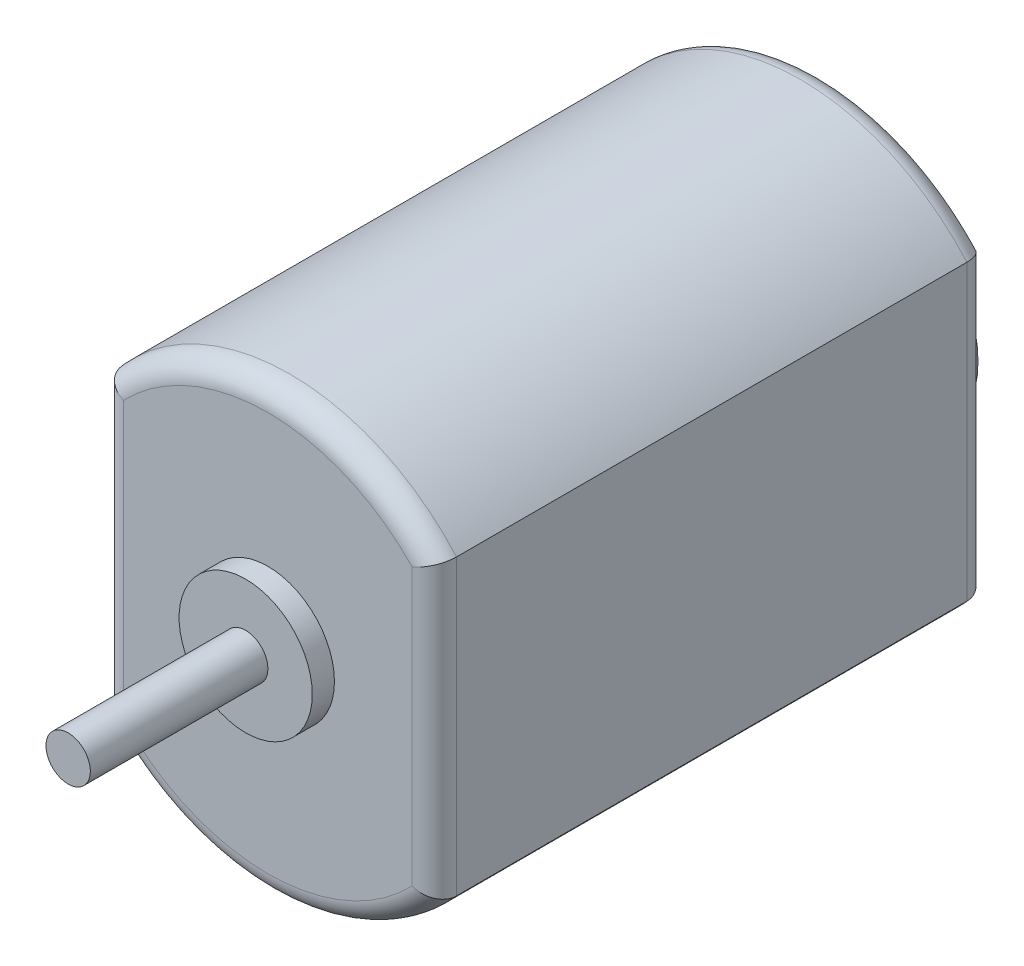
ISO-10303-21;
HEADER;
FILE_DESCRIPTION(('STEP AP214'),'2;1');
FILE_NAME('part.step','',(''),(''),'','','');
FILE_SCHEMA(('AUTOMOTIVE_DESIGN { 1 0 10303 214 1 1 1 1 }'));
ENDSEC;
DATA;
#1=APPLICATION_CONTEXT('core data for automotive mechanical design processes');
#2=APPLICATION_PROTOCOL_DEFINITION('international standard','automotive_design',2000,#1);
#3=PRODUCT_CONTEXT('',#1,'mechanical');
#4=PRODUCT('Part','Part','',(#3));
#5=PRODUCT_RELATED_PRODUCT_CATEGORY('part','',(#4));
#6=PRODUCT_DEFINITION_FORMATION('','',#4);
#7=PRODUCT_DEFINITION_CONTEXT('part definition',#1,'design');
#8=PRODUCT_DEFINITION('design','',#6,#7);
#9=PRODUCT_DEFINITION_SHAPE('','',#8);
#10=(LENGTH_UNIT() NAMED_UNIT(*) SI_UNIT(.MILLI.,.METRE.));
#11=(NAMED_UNIT(*) PLANE_ANGLE_UNIT() SI_UNIT($,.RADIAN.));
#12=(NAMED_UNIT(*) SI_UNIT($,.STERADIAN.) SOLID_ANGLE_UNIT());
#13=UNCERTAINTY_MEASURE_WITH_UNIT(LENGTH_MEASURE(1.E-05),#10,'distance_accuracy_value','');
#14=(GEOMETRIC_REPRESENTATION_CONTEXT(3) GLOBAL_UNCERTAINTY_ASSIGNED_CONTEXT((#13)) GLOBAL_UNIT_ASSIGNED_CONTEXT((#10,
#11,#12)) REPRESENTATION_CONTEXT('',''));
#15=CARTESIAN_POINT('',(0.,0.,0.));
#16=DIRECTION('',(0.,0.,1.));
#17=DIRECTION('',(1.,0.,0.));
#18=AXIS2_PLACEMENT_3D('',#15,#16,#17);
#19=CARTESIAN_POINT('',(0.,0.,-2.));
#20=DIRECTION('',(0.,0.,-1.));
#21=DIRECTION('',(-1.,0.,0.));
#22=AXIS2_PLACEMENT_3D('',#19,#20,#21);
#23=PLANE('',#22);
#24=CARTESIAN_POINT('',(0.,0.,-2.));
#25=DIRECTION('',(0.,0.,-1.));
#26=DIRECTION('',(-1.,0.,0.));
#27=AXIS2_PLACEMENT_3D('',#24,#25,#26);
#28=CIRCLE('',#27,5.);
#29=CARTESIAN_POINT('',(-4.,3.,-2.));
#30=VERTEX_POINT('',#29);
#31=CARTESIAN_POINT('',(-4.,-3.,-2.));
#32=VERTEX_POINT('',#31);
#33=EDGE_CURVE('E130',#30,#32,#28,.T.);
#34=ORIENTED_EDGE('',*,*,#33,.T.);
#35=DIRECTION('',(0.,1.,0.));
#36=VECTOR('',#35,1.);
#37=CARTESIAN_POINT('',(-4.,3.,-2.));
#38=LINE('',#37,#36);
#39=EDGE_CURVE('E119',#32,#30,#38,.T.);
#40=ORIENTED_EDGE('',*,*,#39,.T.);
#41=EDGE_LOOP('',(#34,#40));
#42=FACE_BOUND('',#41,.T.);
#43=CARTESIAN_POINT('',(0.,0.,-2.));
#44=DIRECTION('',(0.,0.,-1.));
#45=DIRECTION('',(-1.,0.,0.));
#46=AXIS2_PLACEMENT_3D('',#43,#44,#45);
#47=CIRCLE('',#46,1.);
#48=CARTESIAN_POINT('',(-1.,0.,-2.));
#49=VERTEX_POINT('',#48);
#50=EDGE_CURVE('E347',#49,#49,#47,.T.);
#51=ORIENTED_EDGE('',*,*,#50,.F.);
#52=EDGE_LOOP('',(#51));
#53=FACE_BOUND('',#52,.T.);
#54=ADVANCED_FACE('F35',(#42,#53),#23,.T.);
#55=CARTESIAN_POINT('',(0.,0.,0.));
#56=DIRECTION('',(0.,0.,1.));
#57=DIRECTION('',(1.,0.,0.));
#58=AXIS2_PLACEMENT_3D('',#55,#56,#57);
#59=PLANE('',#58);
#60=DIRECTION('',(0.,1.,0.));
#61=VECTOR('',#60,1.);
#62=CARTESIAN_POINT('',(6.5,0.,0.));
#63=LINE('',#62,#61);
#64=CARTESIAN_POINT('',(6.5,6.22494979899437,0.));
#65=VERTEX_POINT('',#64);
#66=CARTESIAN_POINT('',(6.5,-6.22494979899437,0.));
#67=VERTEX_POINT('',#66);
#68=EDGE_CURVE('E318',#65,#67,#63,.F.);
#69=ORIENTED_EDGE('',*,*,#68,.T.);
#70=CARTESIAN_POINT('',(0.,0.,0.));
#71=DIRECTION('',(0.,0.,1.));
#72=DIRECTION('',(1.,0.,0.));
#73=AXIS2_PLACEMENT_3D('',#70,#71,#72);
#74=CIRCLE('',#73,9.);
#75=CARTESIAN_POINT('',(-6.5,-6.22494979899437,0.));
#76=VERTEX_POINT('',#75);
#77=EDGE_CURVE('E321',#67,#76,#74,.F.);
#78=ORIENTED_EDGE('',*,*,#77,.T.);
#79=DIRECTION('',(0.,-1.,0.));
#80=VECTOR('',#79,1.);
#81=CARTESIAN_POINT('',(-6.5,0.,0.));
#82=LINE('',#81,#80);
#83=CARTESIAN_POINT('',(-6.5,6.22494979899437,0.));
#84=VERTEX_POINT('',#83);
#85=EDGE_CURVE('E325',#76,#84,#82,.F.);
#86=ORIENTED_EDGE('',*,*,#85,.T.);
#87=CARTESIAN_POINT('',(0.,0.,0.));
#88=DIRECTION('',(0.,0.,1.));
#89=DIRECTION('',(1.,0.,0.));
#90=AXIS2_PLACEMENT_3D('',#87,#88,#89);
#91=CIRCLE('',#90,9.);
#92=EDGE_CURVE('E322',#84,#65,#91,.F.);
#93=ORIENTED_EDGE('',*,*,#92,.T.);
#94=EDGE_LOOP('',(#69,#78,#86,#93));
#95=FACE_BOUND('',#94,.T.);
#96=CARTESIAN_POINT('',(0.,0.,0.));
#97=DIRECTION('',(0.,0.,-1.));
#98=DIRECTION('',(-1.,0.,0.));
#99=AXIS2_PLACEMENT_3D('',#96,#97,#98);
#100=CIRCLE('',#99,5.);
#101=CARTESIAN_POINT('',(-4.,3.,0.));
#102=VERTEX_POINT('',#101);
#103=CARTESIAN_POINT('',(-4.,-3.,0.));
#104=VERTEX_POINT('',#103);
#105=EDGE_CURVE('E137',#102,#104,#100,.T.);
#106=ORIENTED_EDGE('',*,*,#105,.F.);
#107=DIRECTION('',(0.,1.,0.));
#108=VECTOR('',#107,1.);
#109=CARTESIAN_POINT('',(-4.,3.,0.));
#110=LINE('',#109,#108);
#111=EDGE_CURVE('E134',#104,#102,#110,.T.);
#112=ORIENTED_EDGE('',*,*,#111,.F.);
#113=EDGE_LOOP('',(#106,#112));
#114=FACE_BOUND('',#113,.T.);
#115=ADVANCED_FACE('F258',(#95,#114),#59,.F.);
#116=CARTESIAN_POINT('',(0.,0.,26.));
#117=DIRECTION('',(0.,0.,1.));
#118=DIRECTION('',(1.,0.,0.));
#119=AXIS2_PLACEMENT_3D('',#116,#117,#118);
#120=PLANE('',#119);
#121=CARTESIAN_POINT('',(0.,0.,26.));
#122=DIRECTION('',(0.,0.,1.));
#123=DIRECTION('',(1.,0.,0.));
#124=AXIS2_PLACEMENT_3D('',#121,#122,#123);
#125=CIRCLE('',#124,3.);
#126=CARTESIAN_POINT('',(3.,0.,26.));
#127=VERTEX_POINT('',#126);
#128=EDGE_CURVE('E149',#127,#127,#125,.T.);
#129=ORIENTED_EDGE('',*,*,#128,.T.);
#130=EDGE_LOOP('',(#129));
#131=FACE_BOUND('',#130,.T.);
#132=CARTESIAN_POINT('',(0.,0.,26.));
#133=DIRECTION('',(0.,0.,1.));
#134=DIRECTION('',(1.,0.,0.));
#135=AXIS2_PLACEMENT_3D('',#132,#133,#134);
#136=CIRCLE('',#135,1.);
#137=CARTESIAN_POINT('',(1.,0.,26.));
#138=VERTEX_POINT('',#137);
#139=EDGE_CURVE('E138',#138,#138,#136,.T.);
#140=ORIENTED_EDGE('',*,*,#139,.F.);
#141=EDGE_LOOP('',(#140));
#142=FACE_BOUND('',#141,.T.);
#143=ADVANCED_FACE('F265',(#131,#142),#120,.T.);
#144=CARTESIAN_POINT('',(0.,0.,25.));
#145=DIRECTION('',(0.,0.,1.));
#146=DIRECTION('',(1.,0.,0.));
#147=AXIS2_PLACEMENT_3D('',#144,#145,#146);
#148=PLANE('',#147);
#149=DIRECTION('',(0.,-1.,0.));
#150=VECTOR('',#149,1.);
#151=CARTESIAN_POINT('',(-6.5,-6.61437827766148,25.));
#152=LINE('',#151,#150);
#153=CARTESIAN_POINT('',(-6.5,6.22494979899437,25.));
#154=VERTEX_POINT('',#153);
#155=CARTESIAN_POINT('',(-6.5,-6.22494979899437,25.));
#156=VERTEX_POINT('',#155);
#157=EDGE_CURVE('E163',#154,#156,#152,.T.);
#158=ORIENTED_EDGE('',*,*,#157,.T.);
#159=CARTESIAN_POINT('',(0.,0.,25.));
#160=DIRECTION('',(0.,0.,1.));
#161=DIRECTION('',(1.,0.,0.));
#162=AXIS2_PLACEMENT_3D('',#159,#160,#161);
#163=CIRCLE('',#162,9.);
#164=CARTESIAN_POINT('',(6.5,-6.22494979899437,25.));
#165=VERTEX_POINT('',#164);
#166=EDGE_CURVE('E169',#156,#165,#163,.T.);
#167=ORIENTED_EDGE('',*,*,#166,.T.);
#168=DIRECTION('',(0.,1.,0.));
#169=VECTOR('',#168,1.);
#170=CARTESIAN_POINT('',(6.5,6.61437827766148,25.));
#171=LINE('',#170,#169);
#172=CARTESIAN_POINT('',(6.5,6.22494979899437,25.));
#173=VERTEX_POINT('',#172);
#174=EDGE_CURVE('E167',#165,#173,#171,.T.);
#175=ORIENTED_EDGE('',*,*,#174,.T.);
#176=CARTESIAN_POINT('',(0.,0.,25.));
#177=DIRECTION('',(0.,0.,1.));
#178=DIRECTION('',(1.,0.,0.));
#179=AXIS2_PLACEMENT_3D('',#176,#177,#178);
#180=CIRCLE('',#179,9.);
#181=EDGE_CURVE('E165',#173,#154,#180,.T.);
#182=ORIENTED_EDGE('',*,*,#181,.T.);
#183=EDGE_LOOP('',(#158,#167,#175,#182));
#184=FACE_BOUND('',#183,.T.);
#185=CARTESIAN_POINT('',(0.,0.,25.));
#186=DIRECTION('',(0.,0.,1.));
#187=DIRECTION('',(1.,0.,0.));
#188=AXIS2_PLACEMENT_3D('',#185,#186,#187);
#189=CIRCLE('',#188,3.);
#190=CARTESIAN_POINT('',(3.,0.,25.));
#191=VERTEX_POINT('',#190);
#192=EDGE_CURVE('E147',#191,#191,#189,.T.);
#193=ORIENTED_EDGE('',*,*,#192,.F.);
#194=EDGE_LOOP('',(#193));
#195=FACE_BOUND('',#194,.T.);
#196=ADVANCED_FACE('F286',(#184,#195),#148,.T.);
#197=CARTESIAN_POINT('',(0.,0.,25.));
#198=DIRECTION('',(0.,0.,-1.));
#199=DIRECTION('',(-1.,0.,0.));
#200=AXIS2_PLACEMENT_3D('',#197,#198,#199);
#201=CYLINDRICAL_SURFACE('',#200,10.);
#202=DIRECTION('',(0.,0.,-1.));
#203=VECTOR('',#202,1.);
#204=CARTESIAN_POINT('',(7.5,6.61437827766148,25.));
#205=LINE('',#204,#203);
#206=CARTESIAN_POINT('',(7.5,6.61437827766148,24.));
#207=VERTEX_POINT('',#206);
#208=CARTESIAN_POINT('',(7.5,6.61437827766148,1.));
#209=VERTEX_POINT('',#208);
#210=EDGE_CURVE('E152',#207,#209,#205,.T.);
#211=ORIENTED_EDGE('',*,*,#210,.T.);
#212=CARTESIAN_POINT('',(0.,0.,1.));
#213=DIRECTION('',(0.,0.,1.));
#214=DIRECTION('',(1.,0.,0.));
#215=AXIS2_PLACEMENT_3D('',#212,#213,#214);
#216=CIRCLE('',#215,10.);
#217=CARTESIAN_POINT('',(-7.5,6.61437827766148,1.));
#218=VERTEX_POINT('',#217);
#219=EDGE_CURVE('E48',#209,#218,#216,.T.);
#220=ORIENTED_EDGE('',*,*,#219,.T.);
#221=DIRECTION('',(0.,0.,-1.));
#222=VECTOR('',#221,1.);
#223=CARTESIAN_POINT('',(-7.5,6.61437827766148,25.));
#224=LINE('',#223,#222);
#225=CARTESIAN_POINT('',(-7.5,6.61437827766148,24.));
#226=VERTEX_POINT('',#225);
#227=EDGE_CURVE('E161',#226,#218,#224,.T.);
#228=ORIENTED_EDGE('',*,*,#227,.F.);
#229=CARTESIAN_POINT('',(0.,0.,24.));
#230=DIRECTION('',(0.,0.,1.));
#231=DIRECTION('',(1.,0.,0.));
#232=AXIS2_PLACEMENT_3D('',#229,#230,#231);
#233=CIRCLE('',#232,10.);
#234=EDGE_CURVE('E177',#226,#207,#233,.F.);
#235=ORIENTED_EDGE('',*,*,#234,.T.);
#236=EDGE_LOOP('',(#211,#220,#228,#235));
#237=FACE_BOUND('',#236,.T.);
#238=ADVANCED_FACE('F293',(#237),#201,.T.);
#239=CARTESIAN_POINT('',(-7.5,-6.61437827766148,25.));
#240=DIRECTION('',(1.,0.,0.));
#241=DIRECTION('',(0.,0.,-1.));
#242=AXIS2_PLACEMENT_3D('',#239,#240,#241);
#243=PLANE('',#242);
#244=ORIENTED_EDGE('',*,*,#227,.T.);
#245=DIRECTION('',(0.,-1.,0.));
#246=VECTOR('',#245,1.);
#247=CARTESIAN_POINT('',(-7.5,-6.61437827766148,1.));
#248=LINE('',#247,#246);
#249=CARTESIAN_POINT('',(-7.5,-6.61437827766148,1.));
#250=VERTEX_POINT('',#249);
#251=EDGE_CURVE('E11',#218,#250,#248,.T.);
#252=ORIENTED_EDGE('',*,*,#251,.T.);
#253=DIRECTION('',(0.,0.,-1.));
#254=VECTOR('',#253,1.);
#255=CARTESIAN_POINT('',(-7.5,-6.61437827766148,25.));
#256=LINE('',#255,#254);
#257=CARTESIAN_POINT('',(-7.5,-6.61437827766148,24.));
#258=VERTEX_POINT('',#257);
#259=EDGE_CURVE('E158',#258,#250,#256,.T.);
#260=ORIENTED_EDGE('',*,*,#259,.F.);
#261=DIRECTION('',(0.,-1.,0.));
#262=VECTOR('',#261,1.);
#263=CARTESIAN_POINT('',(-7.5,6.61437827766148,24.));
#264=LINE('',#263,#262);
#265=EDGE_CURVE('E179',#258,#226,#264,.F.);
#266=ORIENTED_EDGE('',*,*,#265,.T.);
#267=EDGE_LOOP('',(#244,#252,#260,#266));
#268=FACE_BOUND('',#267,.T.);
#269=ADVANCED_FACE('F301',(#268),#243,.F.);
#270=CARTESIAN_POINT('',(0.,0.,25.));
#271=DIRECTION('',(0.,0.,-1.));
#272=DIRECTION('',(-1.,0.,0.));
#273=AXIS2_PLACEMENT_3D('',#270,#271,#272);
#274=CYLINDRICAL_SURFACE('',#273,10.);
#275=ORIENTED_EDGE('',*,*,#259,.T.);
#276=CARTESIAN_POINT('',(0.,0.,1.));
#277=DIRECTION('',(0.,0.,1.));
#278=DIRECTION('',(1.,0.,0.));
#279=AXIS2_PLACEMENT_3D('',#276,#277,#278);
#280=CIRCLE('',#279,10.);
#281=CARTESIAN_POINT('',(7.5,-6.61437827766148,1.));
#282=VERTEX_POINT('',#281);
#283=EDGE_CURVE('E181',#250,#282,#280,.T.);
#284=ORIENTED_EDGE('',*,*,#283,.T.);
#285=DIRECTION('',(0.,0.,-1.));
#286=VECTOR('',#285,1.);
#287=CARTESIAN_POINT('',(7.5,-6.61437827766148,25.));
#288=LINE('',#287,#286);
#289=CARTESIAN_POINT('',(7.5,-6.61437827766148,24.));
#290=VERTEX_POINT('',#289);
#291=EDGE_CURVE('E156',#290,#282,#288,.T.);
#292=ORIENTED_EDGE('',*,*,#291,.F.);
#293=CARTESIAN_POINT('',(0.,0.,24.));
#294=DIRECTION('',(0.,0.,1.));
#295=DIRECTION('',(1.,0.,0.));
#296=AXIS2_PLACEMENT_3D('',#293,#294,#295);
#297=CIRCLE('',#296,10.);
#298=EDGE_CURVE('E172',#290,#258,#297,.F.);
#299=ORIENTED_EDGE('',*,*,#298,.T.);
#300=EDGE_LOOP('',(#275,#284,#292,#299));
#301=FACE_BOUND('',#300,.T.);
#302=ADVANCED_FACE('F298',(#301),#274,.T.);
#303=CARTESIAN_POINT('',(7.5,-6.61437827766148,25.));
#304=DIRECTION('',(-1.,0.,0.));
#305=DIRECTION('',(0.,-1.,0.));
#306=AXIS2_PLACEMENT_3D('',#303,#304,#305);
#307=PLANE('',#306);
#308=ORIENTED_EDGE('',*,*,#291,.T.);
#309=DIRECTION('',(0.,1.,0.));
#310=VECTOR('',#309,1.);
#311=CARTESIAN_POINT('',(7.5,-6.61437827766148,1.));
#312=LINE('',#311,#310);
#313=EDGE_CURVE('E63',#282,#209,#312,.T.);
#314=ORIENTED_EDGE('',*,*,#313,.T.);
#315=ORIENTED_EDGE('',*,*,#210,.F.);
#316=DIRECTION('',(0.,1.,0.));
#317=VECTOR('',#316,1.);
#318=CARTESIAN_POINT('',(7.5,-6.61437827766148,24.));
#319=LINE('',#318,#317);
#320=EDGE_CURVE('E175',#207,#290,#319,.F.);
#321=ORIENTED_EDGE('',*,*,#320,.T.);
#322=EDGE_LOOP('',(#308,#314,#315,#321));
#323=FACE_BOUND('',#322,.T.);
#324=ADVANCED_FACE('F290',(#323),#307,.F.);
#325=CARTESIAN_POINT('',(0.,0.,26.));
#326=DIRECTION('',(0.,0.,-1.));
#327=DIRECTION('',(-1.,0.,0.));
#328=AXIS2_PLACEMENT_3D('',#325,#326,#327);
#329=CYLINDRICAL_SURFACE('',#328,3.);
#330=ORIENTED_EDGE('',*,*,#128,.F.);
#331=EDGE_LOOP('',(#330));
#332=FACE_BOUND('',#331,.T.);
#333=ORIENTED_EDGE('',*,*,#192,.T.);
#334=EDGE_LOOP('',(#333));
#335=FACE_BOUND('',#334,.T.);
#336=ADVANCED_FACE('F282',(#332,#335),#329,.T.);
#337=CARTESIAN_POINT('',(0.,0.,34.));
#338=DIRECTION('',(0.,0.,-1.));
#339=DIRECTION('',(-1.,0.,0.));
#340=AXIS2_PLACEMENT_3D('',#337,#338,#339);
#341=CYLINDRICAL_SURFACE('',#340,1.);
#342=CARTESIAN_POINT('',(0.,0.,34.));
#343=DIRECTION('',(0.,0.,1.));
#344=DIRECTION('',(1.,0.,0.));
#345=AXIS2_PLACEMENT_3D('',#342,#343,#344);
#346=CIRCLE('',#345,1.);
#347=CARTESIAN_POINT('',(1.,0.,34.));
#348=VERTEX_POINT('',#347);
#349=EDGE_CURVE('E141',#348,#348,#346,.T.);
#350=ORIENTED_EDGE('',*,*,#349,.F.);
#351=EDGE_LOOP('',(#350));
#352=FACE_BOUND('',#351,.T.);
#353=ORIENTED_EDGE('',*,*,#139,.T.);
#354=EDGE_LOOP('',(#353));
#355=FACE_BOUND('',#354,.T.);
#356=ADVANCED_FACE('F278',(#352,#355),#341,.T.);
#357=CARTESIAN_POINT('',(0.,0.,34.));
#358=DIRECTION('',(0.,0.,1.));
#359=DIRECTION('',(1.,0.,0.));
#360=AXIS2_PLACEMENT_3D('',#357,#358,#359);
#361=PLANE('',#360);
#362=ORIENTED_EDGE('',*,*,#349,.T.);
#363=EDGE_LOOP('',(#362));
#364=FACE_BOUND('',#363,.T.);
#365=ADVANCED_FACE('F275',(#364),#361,.T.);
#366=CARTESIAN_POINT('',(0.,0.,-2.));
#367=DIRECTION('',(0.,0.,1.));
#368=DIRECTION('',(1.,0.,0.));
#369=AXIS2_PLACEMENT_3D('',#366,#367,#368);
#370=CYLINDRICAL_SURFACE('',#369,5.);
#371=ORIENTED_EDGE('',*,*,#105,.T.);
#372=DIRECTION('',(0.,0.,1.));
#373=VECTOR('',#372,1.);
#374=CARTESIAN_POINT('',(-4.,-3.,-2.));
#375=LINE('',#374,#373);
#376=EDGE_CURVE('E124',#32,#104,#375,.T.);
#377=ORIENTED_EDGE('',*,*,#376,.F.);
#378=ORIENTED_EDGE('',*,*,#33,.F.);
#379=DIRECTION('',(0.,0.,1.));
#380=VECTOR('',#379,1.);
#381=CARTESIAN_POINT('',(-4.,3.,-2.));
#382=LINE('',#381,#380);
#383=EDGE_CURVE('E127',#30,#102,#382,.T.);
#384=ORIENTED_EDGE('',*,*,#383,.T.);
#385=EDGE_LOOP('',(#371,#377,#378,#384));
#386=FACE_BOUND('',#385,.T.);
#387=ADVANCED_FACE('F136',(#386),#370,.T.);
#388=CARTESIAN_POINT('',(-4.,3.,-2.));
#389=DIRECTION('',(1.,0.,0.));
#390=DIRECTION('',(0.,1.,0.));
#391=AXIS2_PLACEMENT_3D('',#388,#389,#390);
#392=PLANE('',#391);
#393=ORIENTED_EDGE('',*,*,#111,.T.);
#394=ORIENTED_EDGE('',*,*,#383,.F.);
#395=ORIENTED_EDGE('',*,*,#39,.F.);
#396=ORIENTED_EDGE('',*,*,#376,.T.);
#397=EDGE_LOOP('',(#393,#394,#395,#396));
#398=FACE_BOUND('',#397,.T.);
#399=ADVANCED_FACE('F122',(#398),#392,.F.);
#400=CARTESIAN_POINT('',(0.,0.,-2.5));
#401=DIRECTION('',(0.,0.,1.));
#402=DIRECTION('',(1.,0.,0.));
#403=AXIS2_PLACEMENT_3D('',#400,#401,#402);
#404=CYLINDRICAL_SURFACE('',#403,1.);
#405=CARTESIAN_POINT('',(0.,0.,-2.5));
#406=DIRECTION('',(0.,0.,-1.));
#407=DIRECTION('',(-1.,0.,0.));
#408=AXIS2_PLACEMENT_3D('',#405,#406,#407);
#409=CIRCLE('',#408,1.);
#410=CARTESIAN_POINT('',(-1.,0.,-2.5));
#411=VERTEX_POINT('',#410);
#412=EDGE_CURVE('E344',#411,#411,#409,.T.);
#413=ORIENTED_EDGE('',*,*,#412,.F.);
#414=EDGE_LOOP('',(#413));
#415=FACE_BOUND('',#414,.T.);
#416=ORIENTED_EDGE('',*,*,#50,.T.);
#417=EDGE_LOOP('',(#416));
#418=FACE_BOUND('',#417,.T.);
#419=ADVANCED_FACE('F270',(#415,#418),#404,.T.);
#420=CARTESIAN_POINT('',(0.,0.,-2.5));
#421=DIRECTION('',(0.,0.,-1.));
#422=DIRECTION('',(-1.,0.,0.));
#423=AXIS2_PLACEMENT_3D('',#420,#421,#422);
#424=PLANE('',#423);
#425=ORIENTED_EDGE('',*,*,#412,.T.);
#426=EDGE_LOOP('',(#425));
#427=FACE_BOUND('',#426,.T.);
#428=ADVANCED_FACE('F221',(#427),#424,.T.);
#429=CARTESIAN_POINT('',(0.,0.,24.));
#430=DIRECTION('',(0.,0.,1.));
#431=DIRECTION('',(1.,0.,0.));
#432=AXIS2_PLACEMENT_3D('',#429,#430,#431);
#433=TOROIDAL_SURFACE('',#432,9.,1.);
#434=CARTESIAN_POINT('',(7.5,6.61437827766148,24.));
#435=CARTESIAN_POINT('',(7.50000070775486,6.61437842210406,24.0268030740604));
#436=CARTESIAN_POINT('',(7.49892164208524,6.61397070938767,24.0535928341524));
#437=CARTESIAN_POINT('',(7.49462277672622,6.61234564054268,24.1069707050066));
#438=CARTESIAN_POINT('',(7.49140334794055,6.61112842469292,24.1335588498995));
#439=CARTESIAN_POINT('',(7.47859025944818,6.60628204016919,24.2125990543511));
#440=CARTESIAN_POINT('',(7.46584151209883,6.60145803941142,24.2645050293058));
#441=CARTESIAN_POINT('',(7.43241945200209,6.58878872253937,24.3652610470786));
#442=CARTESIAN_POINT('',(7.41174716753527,6.58094379846615,24.4141114854738));
#443=CARTESIAN_POINT('',(7.36322931625037,6.56248668410333,24.5075492341123));
#444=CARTESIAN_POINT('',(7.33538183562103,6.55187375550575,24.5521354026067));
#445=CARTESIAN_POINT('',(7.27264796246685,6.52789298757729,24.6370836824597));
#446=CARTESIAN_POINT('',(7.23759790181229,6.5144608992878,24.6773064343941));
#447=CARTESIAN_POINT('',(7.16204782264177,6.48540284017042,24.7513264250274));
#448=CARTESIAN_POINT('',(7.12154608000981,6.46977617523094,24.785121622795));
#449=CARTESIAN_POINT('',(7.03363450295053,6.43571904228458,24.8475351466267));
#450=CARTESIAN_POINT('',(6.98595337277782,6.41717541093012,24.875709029581));
#451=CARTESIAN_POINT('',(6.88711287674907,6.37855287997912,24.9236673412623));
#452=CARTESIAN_POINT('',(6.83595263840904,6.35847359511585,24.9434496564989));
#453=CARTESIAN_POINT('',(6.73862844503145,6.32008383207698,24.9722513830427));
#454=CARTESIAN_POINT('',(6.69273143074326,6.30190425530877,24.9823687614689));
#455=CARTESIAN_POINT('',(6.6002199520826,6.26509673268579,24.9960597835253));
#456=CARTESIAN_POINT('',(6.55360707098905,6.24646973591246,24.9996462195082));
#457=CARTESIAN_POINT('',(6.50470455666489,6.22683898090259,24.9999917192456));
#458=CARTESIAN_POINT('',(6.50235216794491,6.22589445404307,25.0000000200304));
#459=CARTESIAN_POINT('',(6.5,6.22494979899437,25.));
#460=B_SPLINE_CURVE_WITH_KNOTS('',3,(#434,#435,#436,#437,#438,#439,#440,#441,#442,#443,#444,
#445,#446,#447,#448,#449,#450,#451,#452,#453,#454,#455,#456,#457,#458,#459),.UNSPECIFIED.,.F.,
.F.,(4,2,2,2,2,2,2,2,2,2,2,2,4),(0.,0.0803582131555684,0.160702504657557,0.320863669673694,
0.481004056736592,0.641187201698183,0.805520254521724,0.969905400968539,1.14436927926721,
1.31887707178089,1.46964837101099,1.62012403101409,1.62772879347805),.UNSPECIFIED.);
#461=EDGE_CURVE('E206',#207,#173,#460,.T.);
#462=ORIENTED_EDGE('',*,*,#461,.F.);
#463=ORIENTED_EDGE('',*,*,#234,.F.);
#464=CARTESIAN_POINT('',(-7.5,6.61437827766148,24.));
#465=CARTESIAN_POINT('',(-7.50000070775486,6.61437842210406,24.0268030740604));
#466=CARTESIAN_POINT('',(-7.49892164208524,6.61397070938767,24.0535928341524));
#467=CARTESIAN_POINT('',(-7.49462277672622,6.61234564054268,24.1069707050066));
#468=CARTESIAN_POINT('',(-7.49140334794055,6.61112842469292,24.1335588498995));
#469=CARTESIAN_POINT('',(-7.47859025944818,6.60628204016919,24.2125990543511));
#470=CARTESIAN_POINT('',(-7.46584151209883,6.60145803941142,24.2645050293058));
#471=CARTESIAN_POINT('',(-7.43241945200209,6.58878872253937,24.3652610470786));
#472=CARTESIAN_POINT('',(-7.41174716753527,6.58094379846615,24.4141114854738));
#473=CARTESIAN_POINT('',(-7.36322931625037,6.56248668410333,24.5075492341123));
#474=CARTESIAN_POINT('',(-7.33538183562103,6.55187375550575,24.5521354026067));
#475=CARTESIAN_POINT('',(-7.27264796246685,6.52789298757729,24.6370836824597));
#476=CARTESIAN_POINT('',(-7.23759790181229,6.5144608992878,24.6773064343941));
#477=CARTESIAN_POINT('',(-7.16204782264177,6.48540284017042,24.7513264250274));
#478=CARTESIAN_POINT('',(-7.1215460800098,6.46977617523094,24.785121622795));
#479=CARTESIAN_POINT('',(-7.03363450295053,6.43571904228458,24.8475351466267));
#480=CARTESIAN_POINT('',(-6.98595337277782,6.41717541093012,24.875709029581));
#481=CARTESIAN_POINT('',(-6.88711287674907,6.37855287997912,24.9236673412623));
#482=CARTESIAN_POINT('',(-6.83595263840904,6.35847359511585,24.9434496564989));
#483=CARTESIAN_POINT('',(-6.73862844503145,6.32008383207698,24.9722513830427));
#484=CARTESIAN_POINT('',(-6.69273143074326,6.30190425530877,24.9823687614689));
#485=CARTESIAN_POINT('',(-6.60021995208261,6.26509673268578,24.9960597835253));
#486=CARTESIAN_POINT('',(-6.55360707098905,6.24646973591245,24.9996462195082));
#487=CARTESIAN_POINT('',(-6.50470455666489,6.22683898090259,24.9999917192456));
#488=CARTESIAN_POINT('',(-6.50235216794491,6.22589445404307,25.0000000200304));
#489=CARTESIAN_POINT('',(-6.5,6.22494979899437,25.));
#490=B_SPLINE_CURVE_WITH_KNOTS('',3,(#464,#465,#466,#467,#468,#469,#470,#471,#472,#473,#474,
#475,#476,#477,#478,#479,#480,#481,#482,#483,#484,#485,#486,#487,#488,#489),.UNSPECIFIED.,.F.,
.F.,(4,2,2,2,2,2,2,2,2,2,2,2,4),(0.,0.0803582131555684,0.160702504657557,0.320863669673694,
0.481004056736592,0.641187201698183,0.805520254521728,0.969905400968539,1.14436927926721,
1.31887707178089,1.46964837101099,1.62012403101409,1.62772879347805),.UNSPECIFIED.);
#491=EDGE_CURVE('E212',#154,#226,#490,.F.);
#492=ORIENTED_EDGE('',*,*,#491,.F.);
#493=ORIENTED_EDGE('',*,*,#181,.F.);
#494=EDGE_LOOP('',(#462,#463,#492,#493));
#495=FACE_BOUND('',#494,.T.);
#496=ADVANCED_FACE('F217',(#495),#433,.T.);
#497=CARTESIAN_POINT('',(-6.5,0.,24.));
#498=DIRECTION('',(0.,1.,0.));
#499=DIRECTION('',(0.,0.,1.));
#500=AXIS2_PLACEMENT_3D('',#497,#498,#499);
#501=CYLINDRICAL_SURFACE('',#500,1.);
#502=ORIENTED_EDGE('',*,*,#491,.T.);
#503=ORIENTED_EDGE('',*,*,#265,.F.);
#504=CARTESIAN_POINT('',(-7.5,-6.61437827766148,24.));
#505=CARTESIAN_POINT('',(-7.50000070775486,-6.61437842210406,24.0268030740604));
#506=CARTESIAN_POINT('',(-7.49892164208524,-6.61397070938767,24.0535928341524));
#507=CARTESIAN_POINT('',(-7.49462277672622,-6.61234564054268,24.1069707050066));
#508=CARTESIAN_POINT('',(-7.49140334794055,-6.61112842469292,24.1335588498995));
#509=CARTESIAN_POINT('',(-7.47859025944818,-6.60628204016919,24.2125990543511));
#510=CARTESIAN_POINT('',(-7.46584151209883,-6.60145803941142,24.2645050293058));
#511=CARTESIAN_POINT('',(-7.43241945200209,-6.58878872253937,24.3652610470786));
#512=CARTESIAN_POINT('',(-7.41174716753527,-6.58094379846615,24.4141114854738));
#513=CARTESIAN_POINT('',(-7.36322931625037,-6.56248668410334,24.5075492341123));
#514=CARTESIAN_POINT('',(-7.33538183562103,-6.55187375550575,24.5521354026067));
#515=CARTESIAN_POINT('',(-7.27264796246685,-6.52789298757729,24.6370836824597));
#516=CARTESIAN_POINT('',(-7.23759790181229,-6.5144608992878,24.6773064343941));
#517=CARTESIAN_POINT('',(-7.16204782264177,-6.48540284017042,24.7513264250274));
#518=CARTESIAN_POINT('',(-7.12154608000981,-6.46977617523094,24.785121622795));
#519=CARTESIAN_POINT('',(-7.03363450295053,-6.43571904228458,24.8475351466267));
#520=CARTESIAN_POINT('',(-6.98595337277782,-6.41717541093012,24.875709029581));
#521=CARTESIAN_POINT('',(-6.88711287674907,-6.37855287997912,24.9236673412623));
#522=CARTESIAN_POINT('',(-6.83595263840904,-6.35847359511585,24.9434496564989));
#523=CARTESIAN_POINT('',(-6.73862844503145,-6.32008383207698,24.9722513830427));
#524=CARTESIAN_POINT('',(-6.69273143074326,-6.30190425530877,24.9823687614689));
#525=CARTESIAN_POINT('',(-6.60021995208261,-6.26509673268578,24.9960597835253));
#526=CARTESIAN_POINT('',(-6.55360707098905,-6.24646973591244,24.9996462195082));
#527=CARTESIAN_POINT('',(-6.50470455666489,-6.22683898090258,24.9999917192456));
#528=CARTESIAN_POINT('',(-6.50235216794491,-6.22589445404307,25.0000000200304));
#529=CARTESIAN_POINT('',(-6.5,-6.22494979899437,25.));
#530=B_SPLINE_CURVE_WITH_KNOTS('',3,(#504,#505,#506,#507,#508,#509,#510,#511,#512,#513,#514,
#515,#516,#517,#518,#519,#520,#521,#522,#523,#524,#525,#526,#527,#528,#529),.UNSPECIFIED.,.F.,
.F.,(4,2,2,2,2,2,2,2,2,2,2,2,4),(0.,0.0803582131555683,0.16070250465756,0.320863669673694,
0.481004056736594,0.641187201698183,0.805520254521724,0.969905400968539,1.14436927926721,
1.31887707178089,1.46964837101099,1.62012403101409,1.62772879347805),.UNSPECIFIED.);
#531=EDGE_CURVE('E189',#156,#258,#530,.F.);
#532=ORIENTED_EDGE('',*,*,#531,.F.);
#533=ORIENTED_EDGE('',*,*,#157,.F.);
#534=EDGE_LOOP('',(#502,#503,#532,#533));
#535=FACE_BOUND('',#534,.T.);
#536=ADVANCED_FACE('F201',(#535),#501,.T.);
#537=CARTESIAN_POINT('',(6.5,0.,24.));
#538=DIRECTION('',(0.,-1.,0.));
#539=DIRECTION('',(1.,0.,0.));
#540=AXIS2_PLACEMENT_3D('',#537,#538,#539);
#541=CYLINDRICAL_SURFACE('',#540,1.);
#542=ORIENTED_EDGE('',*,*,#461,.T.);
#543=ORIENTED_EDGE('',*,*,#174,.F.);
#544=CARTESIAN_POINT('',(7.5,-6.61437827766148,24.));
#545=CARTESIAN_POINT('',(7.50000070775486,-6.61437842210406,24.0268030740604));
#546=CARTESIAN_POINT('',(7.49892164208523,-6.61397070938768,24.0535928341524));
#547=CARTESIAN_POINT('',(7.49462277672622,-6.61234564054268,24.1069707050066));
#548=CARTESIAN_POINT('',(7.49140334794055,-6.61112842469292,24.1335588498995));
#549=CARTESIAN_POINT('',(7.47859025944818,-6.60628204016919,24.2125990543511));
#550=CARTESIAN_POINT('',(7.46584151209883,-6.60145803941142,24.2645050293058));
#551=CARTESIAN_POINT('',(7.43241945200208,-6.58878872253937,24.3652610470786));
#552=CARTESIAN_POINT('',(7.41174716753527,-6.58094379846615,24.4141114854738));
#553=CARTESIAN_POINT('',(7.36322931625037,-6.56248668410334,24.5075492341123));
#554=CARTESIAN_POINT('',(7.33538183562103,-6.55187375550575,24.5521354026067));
#555=CARTESIAN_POINT('',(7.27264796246685,-6.52789298757729,24.6370836824597));
#556=CARTESIAN_POINT('',(7.23759790181229,-6.51446089928781,24.6773064343941));
#557=CARTESIAN_POINT('',(7.16204782264176,-6.48540284017043,24.7513264250274));
#558=CARTESIAN_POINT('',(7.1215460800098,-6.46977617523094,24.785121622795));
#559=CARTESIAN_POINT('',(7.03363450295053,-6.43571904228458,24.8475351466267));
#560=CARTESIAN_POINT('',(6.98595337277782,-6.41717541093012,24.875709029581));
#561=CARTESIAN_POINT('',(6.88711287674907,-6.37855287997912,24.9236673412623));
#562=CARTESIAN_POINT('',(6.83595263840904,-6.35847359511585,24.9434496564989));
#563=CARTESIAN_POINT('',(6.73862844503145,-6.32008383207698,24.9722513830427));
#564=CARTESIAN_POINT('',(6.69273143074326,-6.30190425530877,24.9823687614689));
#565=CARTESIAN_POINT('',(6.6002199520826,-6.26509673268579,24.9960597835253));
#566=CARTESIAN_POINT('',(6.55360707098905,-6.24646973591246,24.9996462195082));
#567=CARTESIAN_POINT('',(6.50470455666489,-6.22683898090259,24.9999917192456));
#568=CARTESIAN_POINT('',(6.50235216794491,-6.22589445404307,25.0000000200304));
#569=CARTESIAN_POINT('',(6.5,-6.22494979899437,25.));
#570=B_SPLINE_CURVE_WITH_KNOTS('',3,(#544,#545,#546,#547,#548,#549,#550,#551,#552,#553,#554,
#555,#556,#557,#558,#559,#560,#561,#562,#563,#564,#565,#566,#567,#568,#569),.UNSPECIFIED.,.F.,
.F.,(4,2,2,2,2,2,2,2,2,2,2,2,4),(0.,0.0803582131555684,0.16070250465756,0.320863669673694,
0.481004056736595,0.641187201698183,0.805520254521727,0.969905400968539,1.14436927926721,
1.31887707178089,1.46964837101099,1.62012403101409,1.62772879347805),.UNSPECIFIED.);
#571=EDGE_CURVE('E182',#290,#165,#570,.T.);
#572=ORIENTED_EDGE('',*,*,#571,.F.);
#573=ORIENTED_EDGE('',*,*,#320,.F.);
#574=EDGE_LOOP('',(#542,#543,#572,#573));
#575=FACE_BOUND('',#574,.T.);
#576=ADVANCED_FACE('F198',(#575),#541,.T.);
#577=CARTESIAN_POINT('',(0.,0.,24.));
#578=DIRECTION('',(0.,0.,1.));
#579=DIRECTION('',(1.,0.,0.));
#580=AXIS2_PLACEMENT_3D('',#577,#578,#579);
#581=TOROIDAL_SURFACE('',#580,9.,1.);
#582=ORIENTED_EDGE('',*,*,#531,.T.);
#583=ORIENTED_EDGE('',*,*,#298,.F.);
#584=ORIENTED_EDGE('',*,*,#571,.T.);
#585=ORIENTED_EDGE('',*,*,#166,.F.);
#586=EDGE_LOOP('',(#582,#583,#584,#585));
#587=FACE_BOUND('',#586,.T.);
#588=ADVANCED_FACE('F195',(#587),#581,.T.);
#589=CARTESIAN_POINT('',(0.,0.,1.));
#590=DIRECTION('',(0.,0.,1.));
#591=DIRECTION('',(1.,0.,0.));
#592=AXIS2_PLACEMENT_3D('',#589,#590,#591);
#593=TOROIDAL_SURFACE('',#592,9.,1.);
#594=CARTESIAN_POINT('',(7.5,6.61437827766148,1.));
#595=CARTESIAN_POINT('',(7.50000070775486,6.61437842210406,0.973196925939596));
#596=CARTESIAN_POINT('',(7.49892164208524,6.61397070938767,0.946407165847617));
#597=CARTESIAN_POINT('',(7.49462277672622,6.61234564054268,0.893029294993394));
#598=CARTESIAN_POINT('',(7.49140334794055,6.61112842469292,0.866441150100488));
#599=CARTESIAN_POINT('',(7.47859025944818,6.60628204016919,0.787400945648916));
#600=CARTESIAN_POINT('',(7.46584151209883,6.60145803941142,0.735494970694172));
#601=CARTESIAN_POINT('',(7.43241945200209,6.58878872253937,0.634738952921378));
#602=CARTESIAN_POINT('',(7.41174716753527,6.58094379846615,0.585888514526164));
#603=CARTESIAN_POINT('',(7.36322931625037,6.56248668410333,0.492450765887692));
#604=CARTESIAN_POINT('',(7.33538183562103,6.55187375550575,0.447864597393274));
#605=CARTESIAN_POINT('',(7.27264796246686,6.52789298757729,0.362916317540279));
#606=CARTESIAN_POINT('',(7.23759790181229,6.51446089928781,0.322693565605929));
#607=CARTESIAN_POINT('',(7.16204782264177,6.48540284017042,0.248673574972567));
#608=CARTESIAN_POINT('',(7.1215460800098,6.46977617523094,0.214878377204983));
#609=CARTESIAN_POINT('',(7.03363450295053,6.43571904228458,0.152464853373274));
#610=CARTESIAN_POINT('',(6.98595337277782,6.41717541093012,0.124290970418982));
#611=CARTESIAN_POINT('',(6.88711287674907,6.37855287997911,0.0763326587377154));
#612=CARTESIAN_POINT('',(6.83595263840905,6.35847359511584,0.0565503435010738));
#613=CARTESIAN_POINT('',(6.73862844503144,6.32008383207699,0.0277486169573414));
#614=CARTESIAN_POINT('',(6.69273143074324,6.30190425530881,0.0176312385311318));
#615=CARTESIAN_POINT('',(6.60021995208262,6.26509673268574,0.00394021647468989));
#616=CARTESIAN_POINT('',(6.55360707098912,6.24646973591228,0.000353780491844683));
#617=CARTESIAN_POINT('',(6.5047045566649,6.22683898090257,8.28075438609944E-06));
#618=CARTESIAN_POINT('',(6.50235216794491,6.22589445404306,-2.00303981307657E-08));
#619=CARTESIAN_POINT('',(6.5,6.22494979899437,0.));
#620=B_SPLINE_CURVE_WITH_KNOTS('',3,(#594,#595,#596,#597,#598,#599,#600,#601,#602,#603,#604,
#605,#606,#607,#608,#609,#610,#611,#612,#613,#614,#615,#616,#617,#618,#619),.UNSPECIFIED.,.F.,
.F.,(4,2,2,2,2,2,2,2,2,2,2,2,4),(0.,0.0803582131555716,0.160702504657558,0.320863669673695,
0.481004056736591,0.641187201698179,0.805520254521726,0.969905400968541,1.14436927926721,
1.31887707178089,1.46964837101099,1.62012403101409,1.62772879347805),.UNSPECIFIED.);
#621=EDGE_CURVE('E239',#65,#209,#620,.F.);
#622=ORIENTED_EDGE('',*,*,#621,.F.);
#623=ORIENTED_EDGE('',*,*,#92,.F.);
#624=CARTESIAN_POINT('',(-7.5,6.61437827766148,1.));
#625=CARTESIAN_POINT('',(-7.50000070775486,6.61437842210406,0.973196925939596));
#626=CARTESIAN_POINT('',(-7.49892164208524,6.61397070938767,0.946407165847617));
#627=CARTESIAN_POINT('',(-7.49462277672622,6.61234564054268,0.893029294993394));
#628=CARTESIAN_POINT('',(-7.49140334794055,6.61112842469292,0.866441150100488));
#629=CARTESIAN_POINT('',(-7.47859025944818,6.60628204016919,0.787400945648916));
#630=CARTESIAN_POINT('',(-7.46584151209883,6.60145803941142,0.735494970694172));
#631=CARTESIAN_POINT('',(-7.43241945200209,6.58878872253937,0.634738952921378));
#632=CARTESIAN_POINT('',(-7.41174716753527,6.58094379846615,0.585888514526164));
#633=CARTESIAN_POINT('',(-7.36322931625037,6.56248668410333,0.492450765887692));
#634=CARTESIAN_POINT('',(-7.33538183562103,6.55187375550575,0.447864597393274));
#635=CARTESIAN_POINT('',(-7.27264796246686,6.52789298757729,0.362916317540279));
#636=CARTESIAN_POINT('',(-7.23759790181229,6.51446089928781,0.322693565605929));
#637=CARTESIAN_POINT('',(-7.16204782264177,6.48540284017042,0.248673574972567));
#638=CARTESIAN_POINT('',(-7.1215460800098,6.46977617523094,0.214878377204983));
#639=CARTESIAN_POINT('',(-7.03363450295053,6.43571904228458,0.152464853373274));
#640=CARTESIAN_POINT('',(-6.98595337277782,6.41717541093012,0.124290970418982));
#641=CARTESIAN_POINT('',(-6.88711287674907,6.37855287997911,0.0763326587377155));
#642=CARTESIAN_POINT('',(-6.83595263840905,6.35847359511584,0.0565503435010738));
#643=CARTESIAN_POINT('',(-6.73862844503144,6.32008383207699,0.0277486169573414));
#644=CARTESIAN_POINT('',(-6.69273143074324,6.30190425530881,0.0176312385311317));
#645=CARTESIAN_POINT('',(-6.60021995208262,6.26509673268574,0.00394021647468986));
#646=CARTESIAN_POINT('',(-6.55360707098912,6.24646973591228,0.000353780491844823));
#647=CARTESIAN_POINT('',(-6.5047045566649,6.22683898090257,8.28075438611374E-06));
#648=CARTESIAN_POINT('',(-6.50235216794491,6.22589445404306,-2.00303981232252E-08));
#649=CARTESIAN_POINT('',(-6.5,6.22494979899437,0.));
#650=B_SPLINE_CURVE_WITH_KNOTS('',3,(#624,#625,#626,#627,#628,#629,#630,#631,#632,#633,#634,
#635,#636,#637,#638,#639,#640,#641,#642,#643,#644,#645,#646,#647,#648,#649),.UNSPECIFIED.,.F.,
.F.,(4,2,2,2,2,2,2,2,2,2,2,2,4),(0.,0.0803582131555716,0.160702504657558,0.320863669673695,
0.481004056736591,0.641187201698179,0.805520254521726,0.969905400968541,1.14436927926721,
1.31887707178089,1.46964837101099,1.62012403101409,1.62772879347805),.UNSPECIFIED.);
#651=EDGE_CURVE('E40',#218,#84,#650,.T.);
#652=ORIENTED_EDGE('',*,*,#651,.F.);
#653=ORIENTED_EDGE('',*,*,#219,.F.);
#654=EDGE_LOOP('',(#622,#623,#652,#653));
#655=FACE_BOUND('',#654,.T.);
#656=ADVANCED_FACE('F37',(#655),#593,.T.);
#657=CARTESIAN_POINT('',(-6.5,-6.61437827766148,1.));
#658=DIRECTION('',(0.,-1.,0.));
#659=DIRECTION('',(0.,0.,-1.));
#660=AXIS2_PLACEMENT_3D('',#657,#658,#659);
#661=CYLINDRICAL_SURFACE('',#660,1.);
#662=ORIENTED_EDGE('',*,*,#651,.T.);
#663=ORIENTED_EDGE('',*,*,#85,.F.);
#664=CARTESIAN_POINT('',(-7.5,-6.61437827766148,1.));
#665=CARTESIAN_POINT('',(-7.50000070775486,-6.61437842210406,0.973196925939596));
#666=CARTESIAN_POINT('',(-7.49892164208524,-6.61397070938767,0.946407165847617));
#667=CARTESIAN_POINT('',(-7.49462277672622,-6.61234564054267,0.893029294993394));
#668=CARTESIAN_POINT('',(-7.49140334794055,-6.61112842469292,0.866441150100488));
#669=CARTESIAN_POINT('',(-7.47859025944818,-6.60628204016919,0.787400945648915));
#670=CARTESIAN_POINT('',(-7.46584151209883,-6.60145803941142,0.735494970694172));
#671=CARTESIAN_POINT('',(-7.43241945200209,-6.58878872253937,0.634738952921379));
#672=CARTESIAN_POINT('',(-7.41174716753527,-6.58094379846615,0.585888514526164));
#673=CARTESIAN_POINT('',(-7.36322931625037,-6.56248668410334,0.492450765887692));
#674=CARTESIAN_POINT('',(-7.33538183562103,-6.55187375550575,0.447864597393274));
#675=CARTESIAN_POINT('',(-7.27264796246686,-6.52789298757729,0.36291631754028));
#676=CARTESIAN_POINT('',(-7.23759790181229,-6.51446089928781,0.322693565605929));
#677=CARTESIAN_POINT('',(-7.16204782264177,-6.48540284017042,0.248673574972568));
#678=CARTESIAN_POINT('',(-7.1215460800098,-6.46977617523094,0.214878377204983));
#679=CARTESIAN_POINT('',(-7.03363450295053,-6.43571904228458,0.152464853373274));
#680=CARTESIAN_POINT('',(-6.98595337277782,-6.41717541093012,0.124290970418983));
#681=CARTESIAN_POINT('',(-6.88711287674907,-6.37855287997911,0.0763326587377155));
#682=CARTESIAN_POINT('',(-6.83595263840905,-6.35847359511584,0.0565503435010735));
#683=CARTESIAN_POINT('',(-6.73862844503144,-6.32008383207699,0.0277486169573413));
#684=CARTESIAN_POINT('',(-6.69273143074324,-6.30190425530881,0.0176312385311321));
#685=CARTESIAN_POINT('',(-6.60021995208262,-6.26509673268574,0.00394021647469015));
#686=CARTESIAN_POINT('',(-6.55360707098911,-6.24646973591229,0.000353780491844555));
#687=CARTESIAN_POINT('',(-6.5047045566649,-6.22683898090257,8.2807543860831E-06));
#688=CARTESIAN_POINT('',(-6.50235216794491,-6.22589445404306,-2.00303981403619E-08));
#689=CARTESIAN_POINT('',(-6.5,-6.22494979899437,0.));
#690=B_SPLINE_CURVE_WITH_KNOTS('',3,(#664,#665,#666,#667,#668,#669,#670,#671,#672,#673,#674,
#675,#676,#677,#678,#679,#680,#681,#682,#683,#684,#685,#686,#687,#688,#689),.UNSPECIFIED.,.F.,
.F.,(4,2,2,2,2,2,2,2,2,2,2,2,4),(0.,0.0803582131555717,0.160702504657558,0.320863669673695,
0.481004056736591,0.641187201698179,0.805520254521726,0.969905400968541,1.14436927926721,
1.31887707178089,1.46964837101099,1.62012403101409,1.62772879347805),.UNSPECIFIED.);
#691=EDGE_CURVE('E244',#250,#76,#690,.T.);
#692=ORIENTED_EDGE('',*,*,#691,.F.);
#693=ORIENTED_EDGE('',*,*,#251,.F.);
#694=EDGE_LOOP('',(#662,#663,#692,#693));
#695=FACE_BOUND('',#694,.T.);
#696=ADVANCED_FACE('F229',(#695),#661,.T.);
#697=CARTESIAN_POINT('',(6.5,-6.61437827766148,1.));
#698=DIRECTION('',(0.,1.,0.));
#699=DIRECTION('',(-1.,0.,0.));
#700=AXIS2_PLACEMENT_3D('',#697,#698,#699);
#701=CYLINDRICAL_SURFACE('',#700,1.);
#702=ORIENTED_EDGE('',*,*,#621,.T.);
#703=ORIENTED_EDGE('',*,*,#313,.F.);
#704=CARTESIAN_POINT('',(7.5,-6.61437827766148,1.));
#705=CARTESIAN_POINT('',(7.50000070775486,-6.61437842210406,0.973196925939596));
#706=CARTESIAN_POINT('',(7.49892164208523,-6.61397070938767,0.946407165847617));
#707=CARTESIAN_POINT('',(7.49462277672622,-6.61234564054268,0.893029294993394));
#708=CARTESIAN_POINT('',(7.49140334794055,-6.61112842469292,0.866441150100488));
#709=CARTESIAN_POINT('',(7.47859025944818,-6.6062820401692,0.787400945648915));
#710=CARTESIAN_POINT('',(7.46584151209883,-6.60145803941142,0.735494970694172));
#711=CARTESIAN_POINT('',(7.43241945200209,-6.58878872253937,0.634738952921378));
#712=CARTESIAN_POINT('',(7.41174716753527,-6.58094379846615,0.585888514526164));
#713=CARTESIAN_POINT('',(7.36322931625037,-6.56248668410334,0.492450765887692));
#714=CARTESIAN_POINT('',(7.33538183562103,-6.55187375550575,0.447864597393274));
#715=CARTESIAN_POINT('',(7.27264796246685,-6.5278929875773,0.362916317540279));
#716=CARTESIAN_POINT('',(7.23759790181229,-6.51446089928781,0.322693565605929));
#717=CARTESIAN_POINT('',(7.16204782264176,-6.48540284017043,0.248673574972567));
#718=CARTESIAN_POINT('',(7.1215460800098,-6.46977617523094,0.214878377204983));
#719=CARTESIAN_POINT('',(7.03363450295053,-6.43571904228458,0.152464853373274));
#720=CARTESIAN_POINT('',(6.98595337277782,-6.41717541093013,0.124290970418982));
#721=CARTESIAN_POINT('',(6.88711287674907,-6.37855287997911,0.0763326587377149));
#722=CARTESIAN_POINT('',(6.83595263840904,-6.35847359511584,0.0565503435010733));
#723=CARTESIAN_POINT('',(6.73862844503144,-6.32008383207699,0.027748616957341));
#724=CARTESIAN_POINT('',(6.69273143074324,-6.3019042553088,0.0176312385311316));
#725=CARTESIAN_POINT('',(6.60021995208262,-6.26509673268575,0.00394021647468996));
#726=CARTESIAN_POINT('',(6.5536070709891,-6.24646973591233,0.000353780491844686));
#727=CARTESIAN_POINT('',(6.5047045566649,-6.22683898090258,8.28075438609749E-06));
#728=CARTESIAN_POINT('',(6.50235216794491,-6.22589445404307,-2.00303981326707E-08));
#729=CARTESIAN_POINT('',(6.5,-6.22494979899437,0.));
#730=B_SPLINE_CURVE_WITH_KNOTS('',3,(#704,#705,#706,#707,#708,#709,#710,#711,#712,#713,#714,
#715,#716,#717,#718,#719,#720,#721,#722,#723,#724,#725,#726,#727,#728,#729),.UNSPECIFIED.,.F.,
.F.,(4,2,2,2,2,2,2,2,2,2,2,2,4),(0.,0.0803582131555715,0.160702504657558,0.320863669673694,
0.481004056736591,0.641187201698179,0.805520254521727,0.969905400968541,1.14436927926721,
1.31887707178089,1.469648371011,1.62012403101409,1.62772879347805),.UNSPECIFIED.);
#731=EDGE_CURVE('E234',#67,#282,#730,.F.);
#732=ORIENTED_EDGE('',*,*,#731,.F.);
#733=ORIENTED_EDGE('',*,*,#68,.F.);
#734=EDGE_LOOP('',(#702,#703,#732,#733));
#735=FACE_BOUND('',#734,.T.);
#736=ADVANCED_FACE('F223',(#735),#701,.T.);
#737=CARTESIAN_POINT('',(0.,0.,1.));
#738=DIRECTION('',(0.,0.,1.));
#739=DIRECTION('',(1.,0.,0.));
#740=AXIS2_PLACEMENT_3D('',#737,#738,#739);
#741=TOROIDAL_SURFACE('',#740,9.,1.);
#742=ORIENTED_EDGE('',*,*,#691,.T.);
#743=ORIENTED_EDGE('',*,*,#77,.F.);
#744=ORIENTED_EDGE('',*,*,#731,.T.);
#745=ORIENTED_EDGE('',*,*,#283,.F.);
#746=EDGE_LOOP('',(#742,#743,#744,#745));
#747=FACE_BOUND('',#746,.T.);
#748=ADVANCED_FACE('F228',(#747),#741,.T.);
#749=CLOSED_SHELL('',(#54,#115,#143,#196,#238,#269,#302,#324,#336,#356,#365,#387,#399,#419,#428,
#496,#536,#576,#588,#656,#696,#736,#748));
#750=MANIFOLD_SOLID_BREP('B2',#749);
#751=ADVANCED_BREP_SHAPE_REPRESENTATION('',(#18,#750),#14);
#752=SHAPE_DEFINITION_REPRESENTATION(#9,#751);
ENDSEC;
END-ISO-10303-21;
